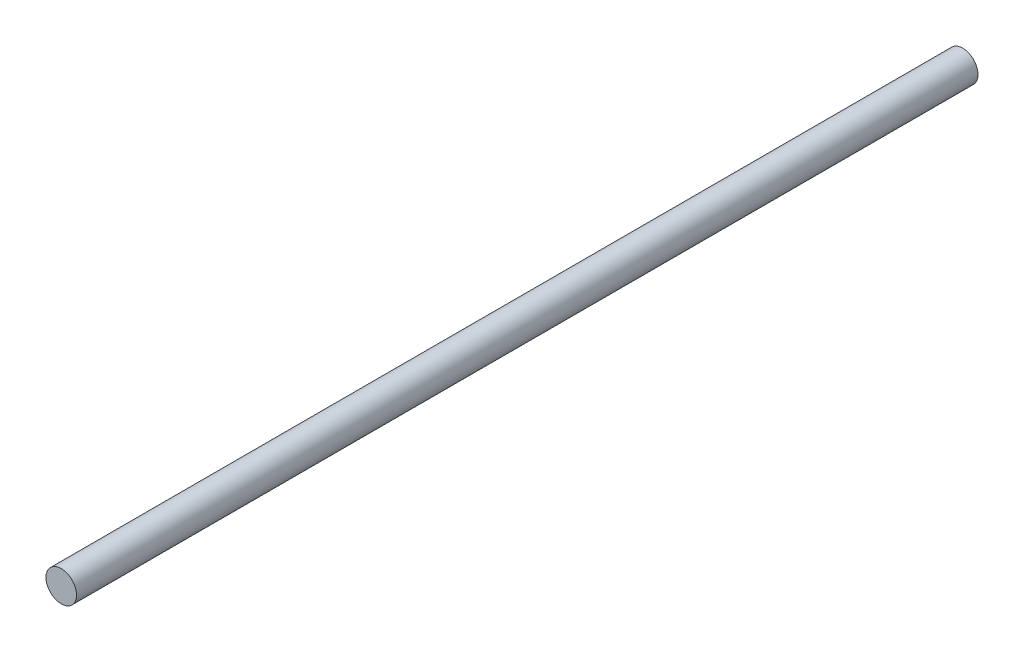
ISO-10303-21;
HEADER;
FILE_DESCRIPTION(('STEP AP214'),'2;1');
FILE_NAME('part.step','',(''),(''),'','','');
FILE_SCHEMA(('AUTOMOTIVE_DESIGN { 1 0 10303 214 1 1 1 1 }'));
ENDSEC;
DATA;
#1=APPLICATION_CONTEXT('core data for automotive mechanical design processes');
#2=APPLICATION_PROTOCOL_DEFINITION('international standard','automotive_design',2000,#1);
#3=PRODUCT_CONTEXT('',#1,'mechanical');
#4=PRODUCT('Part','Part','',(#3));
#5=PRODUCT_RELATED_PRODUCT_CATEGORY('part','',(#4));
#6=PRODUCT_DEFINITION_FORMATION('','',#4);
#7=PRODUCT_DEFINITION_CONTEXT('part definition',#1,'design');
#8=PRODUCT_DEFINITION('design','',#6,#7);
#9=PRODUCT_DEFINITION_SHAPE('','',#8);
#10=(LENGTH_UNIT() NAMED_UNIT(*) SI_UNIT(.MILLI.,.METRE.));
#11=(NAMED_UNIT(*) PLANE_ANGLE_UNIT() SI_UNIT($,.RADIAN.));
#12=(NAMED_UNIT(*) SI_UNIT($,.STERADIAN.) SOLID_ANGLE_UNIT());
#13=UNCERTAINTY_MEASURE_WITH_UNIT(LENGTH_MEASURE(1.E-05),#10,'distance_accuracy_value','');
#14=(GEOMETRIC_REPRESENTATION_CONTEXT(3) GLOBAL_UNCERTAINTY_ASSIGNED_CONTEXT((#13)) GLOBAL_UNIT_ASSIGNED_CONTEXT((#10,
#11,#12)) REPRESENTATION_CONTEXT('',''));
#15=CARTESIAN_POINT('',(0.,0.,0.));
#16=DIRECTION('',(0.,0.,1.));
#17=DIRECTION('',(1.,0.,0.));
#18=AXIS2_PLACEMENT_3D('',#15,#16,#17);
#19=CARTESIAN_POINT('',(0.,0.,147.5));
#20=DIRECTION('',(0.,0.,-1.));
#21=DIRECTION('',(-1.,0.,0.));
#22=AXIS2_PLACEMENT_3D('',#19,#20,#21);
#23=CYLINDRICAL_SURFACE('',#22,5.);
#24=CARTESIAN_POINT('',(0.,0.,147.5));
#25=DIRECTION('',(0.,0.,1.));
#26=DIRECTION('',(1.,0.,0.));
#27=AXIS2_PLACEMENT_3D('',#24,#25,#26);
#28=CIRCLE('',#27,5.);
#29=CARTESIAN_POINT('',(5.,0.,147.5));
#30=VERTEX_POINT('',#29);
#31=EDGE_CURVE('E10',#30,#30,#28,.T.);
#32=ORIENTED_EDGE('',*,*,#31,.F.);
#33=EDGE_LOOP('',(#32));
#34=FACE_BOUND('',#33,.T.);
#35=CARTESIAN_POINT('',(0.,0.,-147.5));
#36=DIRECTION('',(0.,0.,1.));
#37=DIRECTION('',(1.,0.,0.));
#38=AXIS2_PLACEMENT_3D('',#35,#36,#37);
#39=CIRCLE('',#38,5.);
#40=CARTESIAN_POINT('',(5.,0.,-147.5));
#41=VERTEX_POINT('',#40);
#42=EDGE_CURVE('E34',#41,#41,#39,.T.);
#43=ORIENTED_EDGE('',*,*,#42,.T.);
#44=EDGE_LOOP('',(#43));
#45=FACE_BOUND('',#44,.T.);
#46=ADVANCED_FACE('F31',(#34,#45),#23,.T.);
#47=CARTESIAN_POINT('',(0.,0.,147.5));
#48=DIRECTION('',(0.,0.,1.));
#49=DIRECTION('',(1.,0.,0.));
#50=AXIS2_PLACEMENT_3D('',#47,#48,#49);
#51=PLANE('',#50);
#52=ORIENTED_EDGE('',*,*,#31,.T.);
#53=EDGE_LOOP('',(#52));
#54=FACE_BOUND('',#53,.T.);
#55=ADVANCED_FACE('F46',(#54),#51,.T.);
#56=CARTESIAN_POINT('',(0.,0.,-147.5));
#57=DIRECTION('',(0.,0.,1.));
#58=DIRECTION('',(1.,0.,0.));
#59=AXIS2_PLACEMENT_3D('',#56,#57,#58);
#60=PLANE('',#59);
#61=ORIENTED_EDGE('',*,*,#42,.F.);
#62=EDGE_LOOP('',(#61));
#63=FACE_BOUND('',#62,.T.);
#64=ADVANCED_FACE('F44',(#63),#60,.F.);
#65=CLOSED_SHELL('',(#46,#55,#64));
#66=MANIFOLD_SOLID_BREP('B2',#65);
#67=ADVANCED_BREP_SHAPE_REPRESENTATION('',(#18,#66),#14);
#68=SHAPE_DEFINITION_REPRESENTATION(#9,#67);
ENDSEC;
END-ISO-10303-21;
